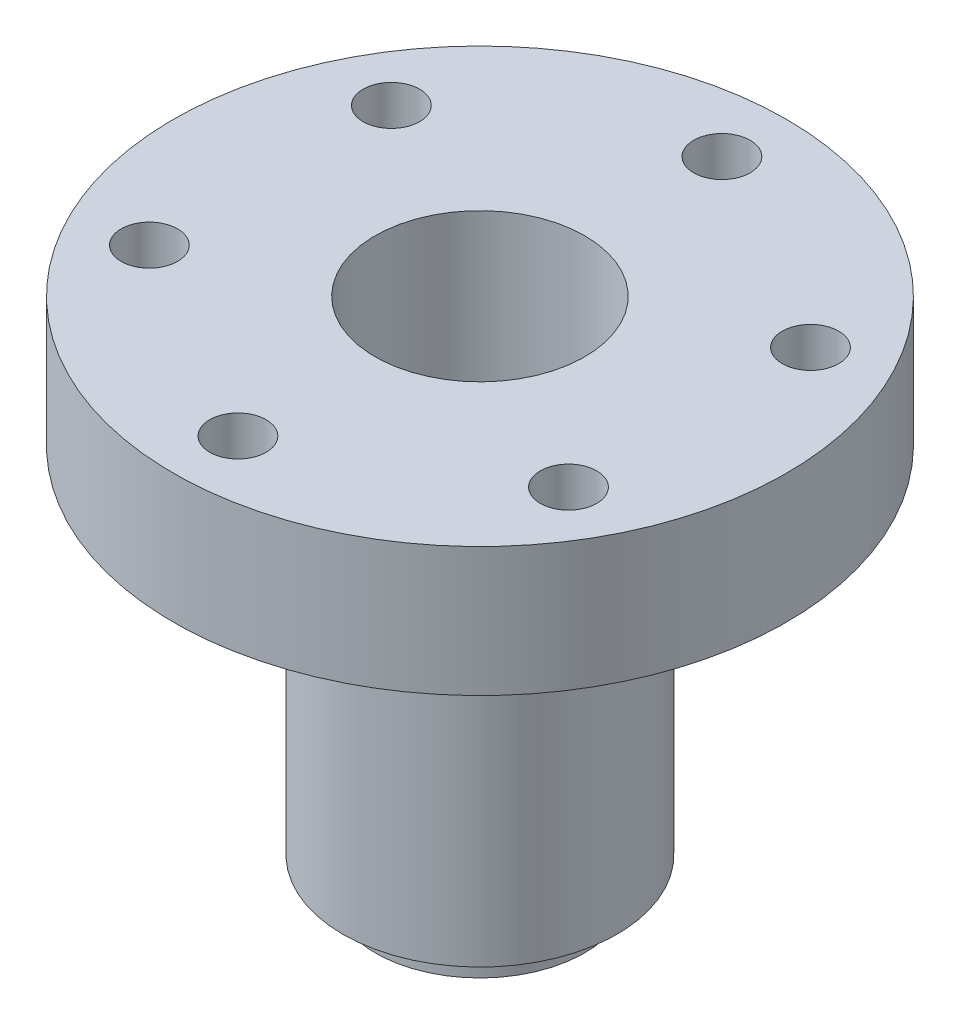
ISO-10303-21;
HEADER;
FILE_DESCRIPTION(('STEP AP214'),'2;1');
FILE_NAME('part.step','',(''),(''),'','','');
FILE_SCHEMA(('AUTOMOTIVE_DESIGN { 1 0 10303 214 1 1 1 1 }'));
ENDSEC;
DATA;
#1=APPLICATION_CONTEXT('core data for automotive mechanical design processes');
#2=APPLICATION_PROTOCOL_DEFINITION('international standard','automotive_design',2000,#1);
#3=PRODUCT_CONTEXT('',#1,'mechanical');
#4=PRODUCT('Part','Part','',(#3));
#5=PRODUCT_RELATED_PRODUCT_CATEGORY('part','',(#4));
#6=PRODUCT_DEFINITION_FORMATION('','',#4);
#7=PRODUCT_DEFINITION_CONTEXT('part definition',#1,'design');
#8=PRODUCT_DEFINITION('design','',#6,#7);
#9=PRODUCT_DEFINITION_SHAPE('','',#8);
#10=(LENGTH_UNIT() NAMED_UNIT(*) SI_UNIT(.MILLI.,.METRE.));
#11=(NAMED_UNIT(*) PLANE_ANGLE_UNIT() SI_UNIT($,.RADIAN.));
#12=(NAMED_UNIT(*) SI_UNIT($,.STERADIAN.) SOLID_ANGLE_UNIT());
#13=UNCERTAINTY_MEASURE_WITH_UNIT(LENGTH_MEASURE(1.E-05),#10,'distance_accuracy_value','');
#14=(GEOMETRIC_REPRESENTATION_CONTEXT(3) GLOBAL_UNCERTAINTY_ASSIGNED_CONTEXT((#13)) GLOBAL_UNIT_ASSIGNED_CONTEXT((#10,
#11,#12)) REPRESENTATION_CONTEXT('',''));
#15=CARTESIAN_POINT('',(0.,0.,0.));
#16=DIRECTION('',(0.,0.,1.));
#17=DIRECTION('',(1.,0.,0.));
#18=AXIS2_PLACEMENT_3D('',#15,#16,#17);
#19=CARTESIAN_POINT('',(0.,3.870918612537,-15.));
#20=DIRECTION('',(0.,1.,0.));
#21=DIRECTION('',(0.,0.,1.));
#22=AXIS2_PLACEMENT_3D('',#19,#20,#21);
#23=CYLINDRICAL_SURFACE('',#22,2.);
#24=CARTESIAN_POINT('',(0.,8.,-15.));
#25=DIRECTION('',(0.,1.,0.));
#26=DIRECTION('',(0.,0.,1.));
#27=AXIS2_PLACEMENT_3D('',#24,#25,#26);
#28=CIRCLE('',#27,2.);
#29=CARTESIAN_POINT('',(0.,8.,-13.));
#30=VERTEX_POINT('',#29);
#31=EDGE_CURVE('P0_E10',#30,#30,#28,.T.);
#32=ORIENTED_EDGE('',*,*,#31,.T.);
#33=EDGE_LOOP('',(#32));
#34=FACE_BOUND('',#33,.T.);
#35=CARTESIAN_POINT('',(0.,16.,-15.));
#36=DIRECTION('',(0.,1.,0.));
#37=DIRECTION('',(0.,0.,1.));
#38=AXIS2_PLACEMENT_3D('',#35,#36,#37);
#39=CIRCLE('',#38,2.);
#40=CARTESIAN_POINT('',(0.,16.,-13.));
#41=VERTEX_POINT('',#40);
#42=EDGE_CURVE('P0_E15',#41,#41,#39,.F.);
#43=ORIENTED_EDGE('',*,*,#42,.T.);
#44=EDGE_LOOP('',(#43));
#45=FACE_BOUND('',#44,.T.);
#46=ADVANCED_FACE('P0_F14',(#34,#45),#23,.T.);
#47=OPEN_SHELL('',(#46));
#48=SHELL_BASED_SURFACE_MODEL('P0_B1',(#47));
#49=CARTESIAN_POINT('',(0.,-16.,0.));
#50=DIRECTION('',(0.,-1.,0.));
#51=DIRECTION('',(0.,0.,-1.));
#52=AXIS2_PLACEMENT_3D('',#49,#50,#51);
#53=PLANE('',#52);
#54=CARTESIAN_POINT('',(0.,-16.,0.));
#55=DIRECTION('',(0.,-1.,0.));
#56=DIRECTION('',(0.,0.,-1.));
#57=AXIS2_PLACEMENT_3D('',#54,#55,#56);
#58=CIRCLE('',#57,6.);
#59=CARTESIAN_POINT('',(0.,-16.,-6.));
#60=VERTEX_POINT('',#59);
#61=EDGE_CURVE('P1_E18',#60,#60,#58,.F.);
#62=ORIENTED_EDGE('',*,*,#61,.T.);
#63=EDGE_LOOP('',(#62));
#64=FACE_BOUND('',#63,.T.);
#65=CARTESIAN_POINT('',(0.,-16.,0.));
#66=DIRECTION('',(0.,-1.,0.));
#67=DIRECTION('',(0.,0.,-1.));
#68=AXIS2_PLACEMENT_3D('',#65,#66,#67);
#69=CIRCLE('',#68,6.5);
#70=CARTESIAN_POINT('',(0.,-16.,-6.5));
#71=VERTEX_POINT('',#70);
#72=EDGE_CURVE('P1_E88',#71,#71,#69,.F.);
#73=ORIENTED_EDGE('',*,*,#72,.F.);
#74=EDGE_LOOP('',(#73));
#75=FACE_BOUND('',#74,.T.);
#76=ADVANCED_FACE('P1_F15',(#64,#75),#53,.T.);
#77=CARTESIAN_POINT('',(0.,17.6,0.));
#78=DIRECTION('',(0.,-1.,0.));
#79=DIRECTION('',(0.,0.,-1.));
#80=AXIS2_PLACEMENT_3D('',#77,#78,#79);
#81=CYLINDRICAL_SURFACE('',#80,6.);
#82=CARTESIAN_POINT('',(0.,-1.,0.));
#83=DIRECTION('',(0.,-1.,0.));
#84=DIRECTION('',(0.,0.,-1.));
#85=AXIS2_PLACEMENT_3D('',#82,#83,#84);
#86=CIRCLE('',#85,6.);
#87=CARTESIAN_POINT('',(0.,-1.,-6.));
#88=VERTEX_POINT('',#87);
#89=EDGE_CURVE('P1_E86',#88,#88,#86,.T.);
#90=ORIENTED_EDGE('',*,*,#89,.F.);
#91=EDGE_LOOP('',(#90));
#92=FACE_BOUND('',#91,.T.);
#93=ORIENTED_EDGE('',*,*,#61,.F.);
#94=EDGE_LOOP('',(#93));
#95=FACE_BOUND('',#94,.T.);
#96=ADVANCED_FACE('P1_F97',(#92,#95),#81,.F.);
#97=CARTESIAN_POINT('',(0.,17.6,0.));
#98=DIRECTION('',(0.,-1.,0.));
#99=DIRECTION('',(0.,0.,-1.));
#100=AXIS2_PLACEMENT_3D('',#97,#98,#99);
#101=CYLINDRICAL_SURFACE('',#100,6.5);
#102=CARTESIAN_POINT('',(0.,-14.,0.));
#103=DIRECTION('',(0.,-1.,0.));
#104=DIRECTION('',(0.,0.,-1.));
#105=AXIS2_PLACEMENT_3D('',#102,#103,#104);
#106=CIRCLE('',#105,6.5);
#107=CARTESIAN_POINT('',(0.,-14.,-6.5));
#108=VERTEX_POINT('',#107);
#109=EDGE_CURVE('P1_E83',#108,#108,#106,.F.);
#110=ORIENTED_EDGE('',*,*,#109,.F.);
#111=EDGE_LOOP('',(#110));
#112=FACE_BOUND('',#111,.T.);
#113=ORIENTED_EDGE('',*,*,#72,.T.);
#114=EDGE_LOOP('',(#113));
#115=FACE_BOUND('',#114,.T.);
#116=ADVANCED_FACE('P1_F99',(#112,#115),#101,.T.);
#117=CARTESIAN_POINT('',(0.,-1.,0.));
#118=DIRECTION('',(0.,-1.,0.));
#119=DIRECTION('',(0.,0.,-1.));
#120=AXIS2_PLACEMENT_3D('',#117,#118,#119);
#121=PLANE('',#120);
#122=CARTESIAN_POINT('',(0.,-1.,0.));
#123=DIRECTION('',(0.,-1.,0.));
#124=DIRECTION('',(0.,0.,-1.));
#125=AXIS2_PLACEMENT_3D('',#122,#123,#124);
#126=CIRCLE('',#125,3.25);
#127=CARTESIAN_POINT('',(0.,-1.,-3.25));
#128=VERTEX_POINT('',#127);
#129=EDGE_CURVE('P1_E80',#128,#128,#126,.F.);
#130=ORIENTED_EDGE('',*,*,#129,.T.);
#131=EDGE_LOOP('',(#130));
#132=FACE_BOUND('',#131,.T.);
#133=ORIENTED_EDGE('',*,*,#89,.T.);
#134=EDGE_LOOP('',(#133));
#135=FACE_BOUND('',#134,.T.);
#136=ADVANCED_FACE('P1_F106',(#132,#135),#121,.T.);
#137=CARTESIAN_POINT('',(0.,-14.,0.));
#138=DIRECTION('',(0.,-1.,0.));
#139=DIRECTION('',(0.,0.,-1.));
#140=AXIS2_PLACEMENT_3D('',#137,#138,#139);
#141=PLANE('',#140);
#142=ORIENTED_EDGE('',*,*,#109,.T.);
#143=EDGE_LOOP('',(#142));
#144=FACE_BOUND('',#143,.T.);
#145=CARTESIAN_POINT('',(0.,-14.,0.));
#146=DIRECTION('',(0.,-1.,0.));
#147=DIRECTION('',(0.,0.,-1.));
#148=AXIS2_PLACEMENT_3D('',#145,#146,#147);
#149=CIRCLE('',#148,8.5);
#150=CARTESIAN_POINT('',(0.,-14.,-8.5));
#151=VERTEX_POINT('',#150);
#152=EDGE_CURVE('P1_E77',#151,#151,#149,.F.);
#153=ORIENTED_EDGE('',*,*,#152,.F.);
#154=EDGE_LOOP('',(#153));
#155=FACE_BOUND('',#154,.T.);
#156=ADVANCED_FACE('P1_F165',(#144,#155),#141,.T.);
#157=CARTESIAN_POINT('',(0.,17.6,0.));
#158=DIRECTION('',(0.,-1.,0.));
#159=DIRECTION('',(0.,0.,-1.));
#160=AXIS2_PLACEMENT_3D('',#157,#158,#159);
#161=CYLINDRICAL_SURFACE('',#160,3.25);
#162=ORIENTED_EDGE('',*,*,#129,.F.);
#163=EDGE_LOOP('',(#162));
#164=FACE_BOUND('',#163,.T.);
#165=CARTESIAN_POINT('',(0.,4.,0.));
#166=DIRECTION('',(0.,-1.,0.));
#167=DIRECTION('',(0.,0.,-1.));
#168=AXIS2_PLACEMENT_3D('',#165,#166,#167);
#169=CIRCLE('',#168,3.25);
#170=CARTESIAN_POINT('',(0.,4.,-3.25));
#171=VERTEX_POINT('',#170);
#172=EDGE_CURVE('P1_E74',#171,#171,#169,.F.);
#173=ORIENTED_EDGE('',*,*,#172,.T.);
#174=EDGE_LOOP('',(#173));
#175=FACE_BOUND('',#174,.T.);
#176=ADVANCED_FACE('P1_F161',(#164,#175),#161,.F.);
#177=CARTESIAN_POINT('',(0.,17.6,0.));
#178=DIRECTION('',(0.,-1.,0.));
#179=DIRECTION('',(0.,0.,-1.));
#180=AXIS2_PLACEMENT_3D('',#177,#178,#179);
#181=CYLINDRICAL_SURFACE('',#180,8.5);
#182=CARTESIAN_POINT('',(0.,8.,0.));
#183=DIRECTION('',(0.,-1.,0.));
#184=DIRECTION('',(0.,0.,-1.));
#185=AXIS2_PLACEMENT_3D('',#182,#183,#184);
#186=CIRCLE('',#185,8.5);
#187=CARTESIAN_POINT('',(0.,8.,-8.5));
#188=VERTEX_POINT('',#187);
#189=EDGE_CURVE('P1_E71',#188,#188,#186,.F.);
#190=ORIENTED_EDGE('',*,*,#189,.F.);
#191=EDGE_LOOP('',(#190));
#192=FACE_BOUND('',#191,.T.);
#193=ORIENTED_EDGE('',*,*,#152,.T.);
#194=EDGE_LOOP('',(#193));
#195=FACE_BOUND('',#194,.T.);
#196=ADVANCED_FACE('P1_F157',(#192,#195),#181,.T.);
#197=CARTESIAN_POINT('',(0.,4.,0.));
#198=DIRECTION('',(0.,-1.,0.));
#199=DIRECTION('',(0.,0.,-1.));
#200=AXIS2_PLACEMENT_3D('',#197,#198,#199);
#201=PLANE('',#200);
#202=ORIENTED_EDGE('',*,*,#172,.F.);
#203=EDGE_LOOP('',(#202));
#204=FACE_BOUND('',#203,.T.);
#205=CARTESIAN_POINT('',(0.,4.,0.));
#206=DIRECTION('',(0.,-1.,0.));
#207=DIRECTION('',(0.,0.,-1.));
#208=AXIS2_PLACEMENT_3D('',#205,#206,#207);
#209=CIRCLE('',#208,6.5);
#210=CARTESIAN_POINT('',(0.,4.,-6.5));
#211=VERTEX_POINT('',#210);
#212=EDGE_CURVE('P1_E65',#211,#211,#209,.F.);
#213=ORIENTED_EDGE('',*,*,#212,.T.);
#214=EDGE_LOOP('',(#213));
#215=FACE_BOUND('',#214,.T.);
#216=ADVANCED_FACE('P1_F153',(#204,#215),#201,.F.);
#217=CARTESIAN_POINT('',(0.,8.,0.));
#218=DIRECTION('',(0.,-1.,0.));
#219=DIRECTION('',(0.,0.,-1.));
#220=AXIS2_PLACEMENT_3D('',#217,#218,#219);
#221=PLANE('',#220);
#222=CARTESIAN_POINT('',(-12.99038105677,8.,-7.5));
#223=DIRECTION('',(0.,1.,0.));
#224=DIRECTION('',(0.,0.,1.));
#225=AXIS2_PLACEMENT_3D('',#222,#223,#224);
#226=CIRCLE('',#225,1.75);
#227=CARTESIAN_POINT('',(-12.99038105677,8.,-5.75));
#228=VERTEX_POINT('',#227);
#229=EDGE_CURVE('P1_E47',#228,#228,#226,.T.);
#230=ORIENTED_EDGE('',*,*,#229,.T.);
#231=EDGE_LOOP('',(#230));
#232=FACE_BOUND('',#231,.T.);
#233=CARTESIAN_POINT('',(-12.99038105677,8.,7.5));
#234=DIRECTION('',(0.,1.,0.));
#235=DIRECTION('',(0.,0.,1.));
#236=AXIS2_PLACEMENT_3D('',#233,#234,#235);
#237=CIRCLE('',#236,1.75);
#238=CARTESIAN_POINT('',(-12.99038105677,8.,9.25));
#239=VERTEX_POINT('',#238);
#240=EDGE_CURVE('P1_E50',#239,#239,#237,.T.);
#241=ORIENTED_EDGE('',*,*,#240,.T.);
#242=EDGE_LOOP('',(#241));
#243=FACE_BOUND('',#242,.T.);
#244=CARTESIAN_POINT('',(0.,8.,15.));
#245=DIRECTION('',(0.,1.,0.));
#246=DIRECTION('',(0.,0.,1.));
#247=AXIS2_PLACEMENT_3D('',#244,#245,#246);
#248=CIRCLE('',#247,1.75);
#249=CARTESIAN_POINT('',(0.,8.,16.75));
#250=VERTEX_POINT('',#249);
#251=EDGE_CURVE('P1_E53',#250,#250,#248,.T.);
#252=ORIENTED_EDGE('',*,*,#251,.T.);
#253=EDGE_LOOP('',(#252));
#254=FACE_BOUND('',#253,.T.);
#255=CARTESIAN_POINT('',(12.99038105677,8.,7.5));
#256=DIRECTION('',(0.,1.,0.));
#257=DIRECTION('',(0.,0.,1.));
#258=AXIS2_PLACEMENT_3D('',#255,#256,#257);
#259=CIRCLE('',#258,1.75);
#260=CARTESIAN_POINT('',(12.99038105677,8.,9.25));
#261=VERTEX_POINT('',#260);
#262=EDGE_CURVE('P1_E56',#261,#261,#259,.T.);
#263=ORIENTED_EDGE('',*,*,#262,.T.);
#264=EDGE_LOOP('',(#263));
#265=FACE_BOUND('',#264,.T.);
#266=CARTESIAN_POINT('',(12.99038105677,8.,-7.5));
#267=DIRECTION('',(0.,1.,0.));
#268=DIRECTION('',(0.,0.,1.));
#269=AXIS2_PLACEMENT_3D('',#266,#267,#268);
#270=CIRCLE('',#269,1.75);
#271=CARTESIAN_POINT('',(12.99038105677,8.,-5.75));
#272=VERTEX_POINT('',#271);
#273=EDGE_CURVE('P1_E59',#272,#272,#270,.T.);
#274=ORIENTED_EDGE('',*,*,#273,.T.);
#275=EDGE_LOOP('',(#274));
#276=FACE_BOUND('',#275,.T.);
#277=CARTESIAN_POINT('',(0.,8.,-15.));
#278=DIRECTION('',(0.,1.,0.));
#279=DIRECTION('',(0.,0.,1.));
#280=AXIS2_PLACEMENT_3D('',#277,#278,#279);
#281=CIRCLE('',#280,1.75);
#282=CARTESIAN_POINT('',(0.,8.,-13.25));
#283=VERTEX_POINT('',#282);
#284=EDGE_CURVE('P1_E62',#283,#283,#281,.T.);
#285=ORIENTED_EDGE('',*,*,#284,.T.);
#286=EDGE_LOOP('',(#285));
#287=FACE_BOUND('',#286,.T.);
#288=ORIENTED_EDGE('',*,*,#189,.T.);
#289=EDGE_LOOP('',(#288));
#290=FACE_BOUND('',#289,.T.);
#291=CARTESIAN_POINT('',(0.,8.,0.));
#292=DIRECTION('',(0.,-1.,0.));
#293=DIRECTION('',(0.,0.,-1.));
#294=AXIS2_PLACEMENT_3D('',#291,#292,#293);
#295=CIRCLE('',#294,19.);
#296=CARTESIAN_POINT('',(0.,8.,-19.));
#297=VERTEX_POINT('',#296);
#298=EDGE_CURVE('P1_E68',#297,#297,#295,.F.);
#299=ORIENTED_EDGE('',*,*,#298,.F.);
#300=EDGE_LOOP('',(#299));
#301=FACE_BOUND('',#300,.T.);
#302=ADVANCED_FACE('P1_F149',(#232,#243,#254,#265,#276,#287,#290,#301),#221,.T.);
#303=CARTESIAN_POINT('',(0.,17.6,0.));
#304=DIRECTION('',(0.,-1.,0.));
#305=DIRECTION('',(0.,0.,-1.));
#306=AXIS2_PLACEMENT_3D('',#303,#304,#305);
#307=CYLINDRICAL_SURFACE('',#306,19.);
#308=ORIENTED_EDGE('',*,*,#298,.T.);
#309=EDGE_LOOP('',(#308));
#310=FACE_BOUND('',#309,.T.);
#311=CARTESIAN_POINT('',(0.,16.,0.));
#312=DIRECTION('',(0.,-1.,0.));
#313=DIRECTION('',(0.,0.,-1.));
#314=AXIS2_PLACEMENT_3D('',#311,#312,#313);
#315=CIRCLE('',#314,19.);
#316=CARTESIAN_POINT('',(0.,16.,-19.));
#317=VERTEX_POINT('',#316);
#318=EDGE_CURVE('P1_E44',#317,#317,#315,.T.);
#319=ORIENTED_EDGE('',*,*,#318,.T.);
#320=EDGE_LOOP('',(#319));
#321=FACE_BOUND('',#320,.T.);
#322=ADVANCED_FACE('P1_F145',(#310,#321),#307,.T.);
#323=CARTESIAN_POINT('',(0.,17.6,0.));
#324=DIRECTION('',(0.,-1.,0.));
#325=DIRECTION('',(0.,0.,-1.));
#326=AXIS2_PLACEMENT_3D('',#323,#324,#325);
#327=CYLINDRICAL_SURFACE('',#326,6.5);
#328=ORIENTED_EDGE('',*,*,#212,.F.);
#329=EDGE_LOOP('',(#328));
#330=FACE_BOUND('',#329,.T.);
#331=CARTESIAN_POINT('',(0.,16.,0.));
#332=DIRECTION('',(0.,-1.,0.));
#333=DIRECTION('',(0.,0.,-1.));
#334=AXIS2_PLACEMENT_3D('',#331,#332,#333);
#335=CIRCLE('',#334,6.5);
#336=CARTESIAN_POINT('',(0.,16.,-6.5));
#337=VERTEX_POINT('',#336);
#338=EDGE_CURVE('P1_E41',#337,#337,#335,.F.);
#339=ORIENTED_EDGE('',*,*,#338,.T.);
#340=EDGE_LOOP('',(#339));
#341=FACE_BOUND('',#340,.T.);
#342=ADVANCED_FACE('P1_F141',(#330,#341),#327,.F.);
#343=CARTESIAN_POINT('',(0.,3.870918612537,-15.));
#344=DIRECTION('',(0.,1.,0.));
#345=DIRECTION('',(0.,0.,1.));
#346=AXIS2_PLACEMENT_3D('',#343,#344,#345);
#347=CYLINDRICAL_SURFACE('',#346,1.75);
#348=ORIENTED_EDGE('',*,*,#284,.F.);
#349=EDGE_LOOP('',(#348));
#350=FACE_BOUND('',#349,.T.);
#351=CARTESIAN_POINT('',(0.,16.,-15.));
#352=DIRECTION('',(0.,1.,0.));
#353=DIRECTION('',(0.,0.,1.));
#354=AXIS2_PLACEMENT_3D('',#351,#352,#353);
#355=CIRCLE('',#354,1.75);
#356=CARTESIAN_POINT('',(0.,16.,-13.25));
#357=VERTEX_POINT('',#356);
#358=EDGE_CURVE('P1_E38',#357,#357,#355,.T.);
#359=ORIENTED_EDGE('',*,*,#358,.T.);
#360=EDGE_LOOP('',(#359));
#361=FACE_BOUND('',#360,.T.);
#362=ADVANCED_FACE('P1_F137',(#350,#361),#347,.F.);
#363=CARTESIAN_POINT('',(12.99038105677,3.870918612537,-7.5));
#364=DIRECTION('',(0.,1.,0.));
#365=DIRECTION('',(0.,0.,1.));
#366=AXIS2_PLACEMENT_3D('',#363,#364,#365);
#367=CYLINDRICAL_SURFACE('',#366,1.75);
#368=ORIENTED_EDGE('',*,*,#273,.F.);
#369=EDGE_LOOP('',(#368));
#370=FACE_BOUND('',#369,.T.);
#371=CARTESIAN_POINT('',(12.99038105677,16.,-7.5));
#372=DIRECTION('',(0.,1.,0.));
#373=DIRECTION('',(0.,0.,1.));
#374=AXIS2_PLACEMENT_3D('',#371,#372,#373);
#375=CIRCLE('',#374,1.75);
#376=CARTESIAN_POINT('',(12.99038105677,16.,-5.75));
#377=VERTEX_POINT('',#376);
#378=EDGE_CURVE('P1_E35',#377,#377,#375,.T.);
#379=ORIENTED_EDGE('',*,*,#378,.T.);
#380=EDGE_LOOP('',(#379));
#381=FACE_BOUND('',#380,.T.);
#382=ADVANCED_FACE('P1_F133',(#370,#381),#367,.F.);
#383=CARTESIAN_POINT('',(12.99038105677,3.870918612537,7.5));
#384=DIRECTION('',(0.,1.,0.));
#385=DIRECTION('',(0.,0.,1.));
#386=AXIS2_PLACEMENT_3D('',#383,#384,#385);
#387=CYLINDRICAL_SURFACE('',#386,1.75);
#388=ORIENTED_EDGE('',*,*,#262,.F.);
#389=EDGE_LOOP('',(#388));
#390=FACE_BOUND('',#389,.T.);
#391=CARTESIAN_POINT('',(12.99038105677,16.,7.5));
#392=DIRECTION('',(0.,1.,0.));
#393=DIRECTION('',(0.,0.,1.));
#394=AXIS2_PLACEMENT_3D('',#391,#392,#393);
#395=CIRCLE('',#394,1.75);
#396=CARTESIAN_POINT('',(12.99038105677,16.,9.25));
#397=VERTEX_POINT('',#396);
#398=EDGE_CURVE('P1_E32',#397,#397,#395,.T.);
#399=ORIENTED_EDGE('',*,*,#398,.T.);
#400=EDGE_LOOP('',(#399));
#401=FACE_BOUND('',#400,.T.);
#402=ADVANCED_FACE('P1_F129',(#390,#401),#387,.F.);
#403=CARTESIAN_POINT('',(0.,3.870918612537,15.));
#404=DIRECTION('',(0.,1.,0.));
#405=DIRECTION('',(0.,0.,1.));
#406=AXIS2_PLACEMENT_3D('',#403,#404,#405);
#407=CYLINDRICAL_SURFACE('',#406,1.75);
#408=ORIENTED_EDGE('',*,*,#251,.F.);
#409=EDGE_LOOP('',(#408));
#410=FACE_BOUND('',#409,.T.);
#411=CARTESIAN_POINT('',(0.,16.,15.));
#412=DIRECTION('',(0.,1.,0.));
#413=DIRECTION('',(0.,0.,1.));
#414=AXIS2_PLACEMENT_3D('',#411,#412,#413);
#415=CIRCLE('',#414,1.75);
#416=CARTESIAN_POINT('',(0.,16.,16.75));
#417=VERTEX_POINT('',#416);
#418=EDGE_CURVE('P1_E27',#417,#417,#415,.T.);
#419=ORIENTED_EDGE('',*,*,#418,.T.);
#420=EDGE_LOOP('',(#419));
#421=FACE_BOUND('',#420,.T.);
#422=ADVANCED_FACE('P1_F125',(#410,#421),#407,.F.);
#423=CARTESIAN_POINT('',(-12.99038105677,3.870918612537,7.5));
#424=DIRECTION('',(0.,1.,0.));
#425=DIRECTION('',(0.,0.,1.));
#426=AXIS2_PLACEMENT_3D('',#423,#424,#425);
#427=CYLINDRICAL_SURFACE('',#426,1.75);
#428=ORIENTED_EDGE('',*,*,#240,.F.);
#429=EDGE_LOOP('',(#428));
#430=FACE_BOUND('',#429,.T.);
#431=CARTESIAN_POINT('',(-12.99038105677,16.,7.5));
#432=DIRECTION('',(0.,1.,0.));
#433=DIRECTION('',(0.,0.,1.));
#434=AXIS2_PLACEMENT_3D('',#431,#432,#433);
#435=CIRCLE('',#434,1.75);
#436=CARTESIAN_POINT('',(-12.99038105677,16.,9.25));
#437=VERTEX_POINT('',#436);
#438=EDGE_CURVE('P1_E22',#437,#437,#435,.T.);
#439=ORIENTED_EDGE('',*,*,#438,.T.);
#440=EDGE_LOOP('',(#439));
#441=FACE_BOUND('',#440,.T.);
#442=ADVANCED_FACE('P1_F118',(#430,#441),#427,.F.);
#443=CARTESIAN_POINT('',(-12.99038105677,3.870918612537,-7.5));
#444=DIRECTION('',(0.,1.,0.));
#445=DIRECTION('',(0.,0.,1.));
#446=AXIS2_PLACEMENT_3D('',#443,#444,#445);
#447=CYLINDRICAL_SURFACE('',#446,1.75);
#448=ORIENTED_EDGE('',*,*,#229,.F.);
#449=EDGE_LOOP('',(#448));
#450=FACE_BOUND('',#449,.T.);
#451=CARTESIAN_POINT('',(-12.99038105677,16.,-7.5));
#452=DIRECTION('',(0.,1.,0.));
#453=DIRECTION('',(0.,0.,1.));
#454=AXIS2_PLACEMENT_3D('',#451,#452,#453);
#455=CIRCLE('',#454,1.75);
#456=CARTESIAN_POINT('',(-12.99038105677,16.,-5.75));
#457=VERTEX_POINT('',#456);
#458=EDGE_CURVE('P1_E10',#457,#457,#455,.T.);
#459=ORIENTED_EDGE('',*,*,#458,.T.);
#460=EDGE_LOOP('',(#459));
#461=FACE_BOUND('',#460,.T.);
#462=ADVANCED_FACE('P1_F112',(#450,#461),#447,.F.);
#463=CARTESIAN_POINT('',(0.,16.,0.));
#464=DIRECTION('',(0.,-1.,0.));
#465=DIRECTION('',(0.,0.,-1.));
#466=AXIS2_PLACEMENT_3D('',#463,#464,#465);
#467=PLANE('',#466);
#468=ORIENTED_EDGE('',*,*,#458,.F.);
#469=EDGE_LOOP('',(#468));
#470=FACE_BOUND('',#469,.T.);
#471=ORIENTED_EDGE('',*,*,#438,.F.);
#472=EDGE_LOOP('',(#471));
#473=FACE_BOUND('',#472,.T.);
#474=ORIENTED_EDGE('',*,*,#418,.F.);
#475=EDGE_LOOP('',(#474));
#476=FACE_BOUND('',#475,.T.);
#477=ORIENTED_EDGE('',*,*,#398,.F.);
#478=EDGE_LOOP('',(#477));
#479=FACE_BOUND('',#478,.T.);
#480=ORIENTED_EDGE('',*,*,#378,.F.);
#481=EDGE_LOOP('',(#480));
#482=FACE_BOUND('',#481,.T.);
#483=ORIENTED_EDGE('',*,*,#358,.F.);
#484=EDGE_LOOP('',(#483));
#485=FACE_BOUND('',#484,.T.);
#486=ORIENTED_EDGE('',*,*,#338,.F.);
#487=EDGE_LOOP('',(#486));
#488=FACE_BOUND('',#487,.T.);
#489=ORIENTED_EDGE('',*,*,#318,.F.);
#490=EDGE_LOOP('',(#489));
#491=FACE_BOUND('',#490,.T.);
#492=ADVANCED_FACE('P1_F110',(#470,#473,#476,#479,#482,#485,#488,#491),#467,.F.);
#493=CLOSED_SHELL('',(#76,#96,#116,#136,#156,#176,#196,#216,#302,#322,#342,#362,#382,#402,#422,
#442,#462,#492));
#494=MANIFOLD_SOLID_BREP('P1_B1',#493);
#495=CARTESIAN_POINT('',(12.99038105677,3.870918612537,-7.5));
#496=DIRECTION('',(0.,1.,0.));
#497=DIRECTION('',(0.,0.,1.));
#498=AXIS2_PLACEMENT_3D('',#495,#496,#497);
#499=CYLINDRICAL_SURFACE('',#498,2.);
#500=CARTESIAN_POINT('',(12.99038105677,8.,-7.5));
#501=DIRECTION('',(0.,1.,0.));
#502=DIRECTION('',(0.,0.,1.));
#503=AXIS2_PLACEMENT_3D('',#500,#501,#502);
#504=CIRCLE('',#503,2.);
#505=CARTESIAN_POINT('',(12.99038105677,8.,-5.5));
#506=VERTEX_POINT('',#505);
#507=EDGE_CURVE('P2_E10',#506,#506,#504,.T.);
#508=ORIENTED_EDGE('',*,*,#507,.T.);
#509=EDGE_LOOP('',(#508));
#510=FACE_BOUND('',#509,.T.);
#511=CARTESIAN_POINT('',(12.99038105677,16.,-7.5));
#512=DIRECTION('',(0.,1.,0.));
#513=DIRECTION('',(0.,0.,1.));
#514=AXIS2_PLACEMENT_3D('',#511,#512,#513);
#515=CIRCLE('',#514,2.);
#516=CARTESIAN_POINT('',(12.99038105677,16.,-5.5));
#517=VERTEX_POINT('',#516);
#518=EDGE_CURVE('P2_E15',#517,#517,#515,.F.);
#519=ORIENTED_EDGE('',*,*,#518,.T.);
#520=EDGE_LOOP('',(#519));
#521=FACE_BOUND('',#520,.T.);
#522=ADVANCED_FACE('P2_F14',(#510,#521),#499,.T.);
#523=OPEN_SHELL('',(#522));
#524=SHELL_BASED_SURFACE_MODEL('P2_B1',(#523));
#525=CARTESIAN_POINT('',(12.99038105677,3.870918612537,7.5));
#526=DIRECTION('',(0.,1.,0.));
#527=DIRECTION('',(0.,0.,1.));
#528=AXIS2_PLACEMENT_3D('',#525,#526,#527);
#529=CYLINDRICAL_SURFACE('',#528,2.);
#530=CARTESIAN_POINT('',(12.99038105677,8.,7.5));
#531=DIRECTION('',(0.,1.,0.));
#532=DIRECTION('',(0.,0.,1.));
#533=AXIS2_PLACEMENT_3D('',#530,#531,#532);
#534=CIRCLE('',#533,2.);
#535=CARTESIAN_POINT('',(12.99038105677,8.,9.5));
#536=VERTEX_POINT('',#535);
#537=EDGE_CURVE('P3_E10',#536,#536,#534,.T.);
#538=ORIENTED_EDGE('',*,*,#537,.T.);
#539=EDGE_LOOP('',(#538));
#540=FACE_BOUND('',#539,.T.);
#541=CARTESIAN_POINT('',(12.99038105677,16.,7.5));
#542=DIRECTION('',(0.,1.,0.));
#543=DIRECTION('',(0.,0.,1.));
#544=AXIS2_PLACEMENT_3D('',#541,#542,#543);
#545=CIRCLE('',#544,2.);
#546=CARTESIAN_POINT('',(12.99038105677,16.,9.5));
#547=VERTEX_POINT('',#546);
#548=EDGE_CURVE('P3_E16',#547,#547,#545,.F.);
#549=ORIENTED_EDGE('',*,*,#548,.T.);
#550=EDGE_LOOP('',(#549));
#551=FACE_BOUND('',#550,.T.);
#552=ADVANCED_FACE('P3_F15',(#540,#551),#529,.T.);
#553=OPEN_SHELL('',(#552));
#554=SHELL_BASED_SURFACE_MODEL('P3_B1',(#553));
#555=CARTESIAN_POINT('',(0.,3.870918612537,15.));
#556=DIRECTION('',(0.,1.,0.));
#557=DIRECTION('',(0.,0.,1.));
#558=AXIS2_PLACEMENT_3D('',#555,#556,#557);
#559=CYLINDRICAL_SURFACE('',#558,2.);
#560=CARTESIAN_POINT('',(0.,8.,15.));
#561=DIRECTION('',(0.,1.,0.));
#562=DIRECTION('',(0.,0.,1.));
#563=AXIS2_PLACEMENT_3D('',#560,#561,#562);
#564=CIRCLE('',#563,2.);
#565=CARTESIAN_POINT('',(0.,8.,17.));
#566=VERTEX_POINT('',#565);
#567=EDGE_CURVE('P4_E10',#566,#566,#564,.T.);
#568=ORIENTED_EDGE('',*,*,#567,.T.);
#569=EDGE_LOOP('',(#568));
#570=FACE_BOUND('',#569,.T.);
#571=CARTESIAN_POINT('',(0.,16.,15.));
#572=DIRECTION('',(0.,1.,0.));
#573=DIRECTION('',(0.,0.,1.));
#574=AXIS2_PLACEMENT_3D('',#571,#572,#573);
#575=CIRCLE('',#574,2.);
#576=CARTESIAN_POINT('',(0.,16.,17.));
#577=VERTEX_POINT('',#576);
#578=EDGE_CURVE('P4_E16',#577,#577,#575,.F.);
#579=ORIENTED_EDGE('',*,*,#578,.T.);
#580=EDGE_LOOP('',(#579));
#581=FACE_BOUND('',#580,.T.);
#582=ADVANCED_FACE('P4_F15',(#570,#581),#559,.T.);
#583=OPEN_SHELL('',(#582));
#584=SHELL_BASED_SURFACE_MODEL('P4_B1',(#583));
#585=CARTESIAN_POINT('',(-12.99038105677,3.870918612537,7.5));
#586=DIRECTION('',(0.,1.,0.));
#587=DIRECTION('',(0.,0.,1.));
#588=AXIS2_PLACEMENT_3D('',#585,#586,#587);
#589=CYLINDRICAL_SURFACE('',#588,2.);
#590=CARTESIAN_POINT('',(-12.99038105677,8.,7.5));
#591=DIRECTION('',(0.,1.,0.));
#592=DIRECTION('',(0.,0.,1.));
#593=AXIS2_PLACEMENT_3D('',#590,#591,#592);
#594=CIRCLE('',#593,2.);
#595=CARTESIAN_POINT('',(-12.99038105677,8.,9.5));
#596=VERTEX_POINT('',#595);
#597=EDGE_CURVE('P5_E10',#596,#596,#594,.T.);
#598=ORIENTED_EDGE('',*,*,#597,.T.);
#599=EDGE_LOOP('',(#598));
#600=FACE_BOUND('',#599,.T.);
#601=CARTESIAN_POINT('',(-12.99038105677,16.,7.5));
#602=DIRECTION('',(0.,1.,0.));
#603=DIRECTION('',(0.,0.,1.));
#604=AXIS2_PLACEMENT_3D('',#601,#602,#603);
#605=CIRCLE('',#604,2.);
#606=CARTESIAN_POINT('',(-12.99038105677,16.,9.5));
#607=VERTEX_POINT('',#606);
#608=EDGE_CURVE('P5_E16',#607,#607,#605,.F.);
#609=ORIENTED_EDGE('',*,*,#608,.T.);
#610=EDGE_LOOP('',(#609));
#611=FACE_BOUND('',#610,.T.);
#612=ADVANCED_FACE('P5_F15',(#600,#611),#589,.T.);
#613=OPEN_SHELL('',(#612));
#614=SHELL_BASED_SURFACE_MODEL('P5_B1',(#613));
#615=CARTESIAN_POINT('',(-12.99038105677,3.870918612537,-7.5));
#616=DIRECTION('',(0.,1.,0.));
#617=DIRECTION('',(0.,0.,1.));
#618=AXIS2_PLACEMENT_3D('',#615,#616,#617);
#619=CYLINDRICAL_SURFACE('',#618,2.);
#620=CARTESIAN_POINT('',(-12.99038105677,8.,-7.5));
#621=DIRECTION('',(0.,1.,0.));
#622=DIRECTION('',(0.,0.,1.));
#623=AXIS2_PLACEMENT_3D('',#620,#621,#622);
#624=CIRCLE('',#623,2.);
#625=CARTESIAN_POINT('',(-12.99038105677,8.,-5.5));
#626=VERTEX_POINT('',#625);
#627=EDGE_CURVE('P6_E10',#626,#626,#624,.T.);
#628=ORIENTED_EDGE('',*,*,#627,.T.);
#629=EDGE_LOOP('',(#628));
#630=FACE_BOUND('',#629,.T.);
#631=CARTESIAN_POINT('',(-12.99038105677,16.,-7.5));
#632=DIRECTION('',(0.,1.,0.));
#633=DIRECTION('',(0.,0.,1.));
#634=AXIS2_PLACEMENT_3D('',#631,#632,#633);
#635=CIRCLE('',#634,2.);
#636=CARTESIAN_POINT('',(-12.99038105677,16.,-5.5));
#637=VERTEX_POINT('',#636);
#638=EDGE_CURVE('P6_E15',#637,#637,#635,.F.);
#639=ORIENTED_EDGE('',*,*,#638,.T.);
#640=EDGE_LOOP('',(#639));
#641=FACE_BOUND('',#640,.T.);
#642=ADVANCED_FACE('P6_F14',(#630,#641),#619,.T.);
#643=OPEN_SHELL('',(#642));
#644=SHELL_BASED_SURFACE_MODEL('P6_B1',(#643));
#645=ADVANCED_BREP_SHAPE_REPRESENTATION('',(#18,#494),#14);
#646=MANIFOLD_SURFACE_SHAPE_REPRESENTATION('',(#18,#48,#524,#554,#584,#614,#644),#14);
#647=SHAPE_REPRESENTATION('',(#18),#14);
#648=SHAPE_DEFINITION_REPRESENTATION(#9,#647);
#649=SHAPE_REPRESENTATION_RELATIONSHIP('','',#647,#645);
#650=SHAPE_REPRESENTATION_RELATIONSHIP('','',#647,#646);
ENDSEC;
END-ISO-10303-21;
